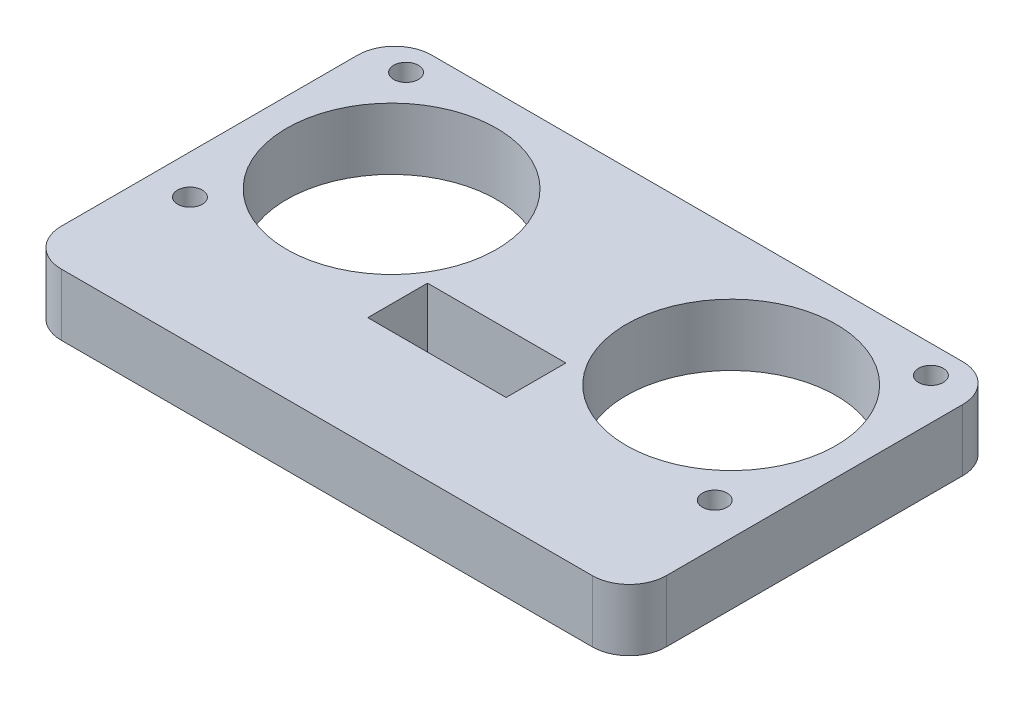
ISO-10303-21;
HEADER;
FILE_DESCRIPTION(('STEP AP214'),'2;1');
FILE_NAME('part.step','',(''),(''),'','','');
FILE_SCHEMA(('AUTOMOTIVE_DESIGN { 1 0 10303 214 1 1 1 1 }'));
ENDSEC;
DATA;
#1=APPLICATION_CONTEXT('core data for automotive mechanical design processes');
#2=APPLICATION_PROTOCOL_DEFINITION('international standard','automotive_design',2000,#1);
#3=PRODUCT_CONTEXT('',#1,'mechanical');
#4=PRODUCT('Part','Part','',(#3));
#5=PRODUCT_RELATED_PRODUCT_CATEGORY('part','',(#4));
#6=PRODUCT_DEFINITION_FORMATION('','',#4);
#7=PRODUCT_DEFINITION_CONTEXT('part definition',#1,'design');
#8=PRODUCT_DEFINITION('design','',#6,#7);
#9=PRODUCT_DEFINITION_SHAPE('','',#8);
#10=(LENGTH_UNIT() NAMED_UNIT(*) SI_UNIT(.MILLI.,.METRE.));
#11=(NAMED_UNIT(*) PLANE_ANGLE_UNIT() SI_UNIT($,.RADIAN.));
#12=(NAMED_UNIT(*) SI_UNIT($,.STERADIAN.) SOLID_ANGLE_UNIT());
#13=UNCERTAINTY_MEASURE_WITH_UNIT(LENGTH_MEASURE(1.E-05),#10,'distance_accuracy_value','');
#14=(GEOMETRIC_REPRESENTATION_CONTEXT(3) GLOBAL_UNCERTAINTY_ASSIGNED_CONTEXT((#13)) GLOBAL_UNIT_ASSIGNED_CONTEXT((#10,
#11,#12)) REPRESENTATION_CONTEXT('',''));
#15=CARTESIAN_POINT('',(0.,0.,0.));
#16=DIRECTION('',(0.,0.,1.));
#17=DIRECTION('',(1.,0.,0.));
#18=AXIS2_PLACEMENT_3D('',#15,#16,#17);
#19=CARTESIAN_POINT('',(0.,3.5,0.));
#20=DIRECTION('',(0.,1.,0.));
#21=DIRECTION('',(0.,0.,1.));
#22=AXIS2_PLACEMENT_3D('',#19,#20,#21);
#23=PLANE('',#22);
#24=CARTESIAN_POINT('',(21.170851111303,3.5,-56.75));
#25=DIRECTION('',(0.,-1.,0.));
#26=DIRECTION('',(0.,0.,-1.));
#27=AXIS2_PLACEMENT_3D('',#24,#25,#26);
#28=CIRCLE('',#27,1.);
#29=CARTESIAN_POINT('',(21.170851111303,3.5,-57.75));
#30=VERTEX_POINT('',#29);
#31=EDGE_CURVE('E325',#30,#30,#28,.T.);
#32=ORIENTED_EDGE('',*,*,#31,.F.);
#33=EDGE_LOOP('',(#32));
#34=FACE_BOUND('',#33,.T.);
#35=CARTESIAN_POINT('',(-21.329148888697,3.5,-56.75));
#36=DIRECTION('',(0.,-1.,0.));
#37=DIRECTION('',(0.,0.,-1.));
#38=AXIS2_PLACEMENT_3D('',#35,#36,#37);
#39=CIRCLE('',#38,1.);
#40=CARTESIAN_POINT('',(-21.329148888697,3.5,-57.75));
#41=VERTEX_POINT('',#40);
#42=EDGE_CURVE('E321',#41,#41,#39,.F.);
#43=ORIENTED_EDGE('',*,*,#42,.T.);
#44=EDGE_LOOP('',(#43));
#45=FACE_BOUND('',#44,.T.);
#46=CARTESIAN_POINT('',(-21.329148888697,3.5,-39.25));
#47=DIRECTION('',(0.,-1.,0.));
#48=DIRECTION('',(0.,0.,-1.));
#49=AXIS2_PLACEMENT_3D('',#46,#47,#48);
#50=CIRCLE('',#49,1.);
#51=CARTESIAN_POINT('',(-21.329148888697,3.5,-40.25));
#52=VERTEX_POINT('',#51);
#53=EDGE_CURVE('E304',#52,#52,#50,.F.);
#54=ORIENTED_EDGE('',*,*,#53,.T.);
#55=EDGE_LOOP('',(#54));
#56=FACE_BOUND('',#55,.T.);
#57=CARTESIAN_POINT('',(13.75,3.5,-48.));
#58=DIRECTION('',(0.,1.,0.));
#59=DIRECTION('',(0.,0.,1.));
#60=AXIS2_PLACEMENT_3D('',#57,#58,#59);
#61=CIRCLE('',#60,8.5);
#62=CARTESIAN_POINT('',(13.75,3.5,-39.5));
#63=VERTEX_POINT('',#62);
#64=EDGE_CURVE('E213',#63,#63,#61,.T.);
#65=ORIENTED_EDGE('',*,*,#64,.T.);
#66=EDGE_LOOP('',(#65));
#67=FACE_BOUND('',#66,.T.);
#68=DIRECTION('',(0.,0.,-1.));
#69=VECTOR('',#68,1.);
#70=CARTESIAN_POINT('',(5.52085111130302,3.5,0.));
#71=LINE('',#70,#69);
#72=CARTESIAN_POINT('',(5.52085111130303,3.5,-38.));
#73=VERTEX_POINT('',#72);
#74=CARTESIAN_POINT('',(5.52085111130303,3.5,-42.84));
#75=VERTEX_POINT('',#74);
#76=EDGE_CURVE('E227',#73,#75,#71,.T.);
#77=ORIENTED_EDGE('',*,*,#76,.T.);
#78=DIRECTION('',(-1.,0.,0.));
#79=VECTOR('',#78,1.);
#80=CARTESIAN_POINT('',(0.,3.5,-42.84));
#81=LINE('',#80,#79);
#82=CARTESIAN_POINT('',(-5.67914888869696,3.5,-42.84));
#83=VERTEX_POINT('',#82);
#84=EDGE_CURVE('E212',#75,#83,#81,.T.);
#85=ORIENTED_EDGE('',*,*,#84,.T.);
#86=DIRECTION('',(0.,0.,1.));
#87=VECTOR('',#86,1.);
#88=CARTESIAN_POINT('',(-5.67914888869696,3.5,0.));
#89=LINE('',#88,#87);
#90=CARTESIAN_POINT('',(-5.67914888869696,3.5,-38.));
#91=VERTEX_POINT('',#90);
#92=EDGE_CURVE('E231',#83,#91,#89,.T.);
#93=ORIENTED_EDGE('',*,*,#92,.T.);
#94=DIRECTION('',(1.,0.,0.));
#95=VECTOR('',#94,1.);
#96=CARTESIAN_POINT('',(0.,3.5,-38.));
#97=LINE('',#96,#95);
#98=EDGE_CURVE('E206',#91,#73,#97,.T.);
#99=ORIENTED_EDGE('',*,*,#98,.T.);
#100=EDGE_LOOP('',(#77,#85,#93,#99));
#101=FACE_BOUND('',#100,.T.);
#102=CARTESIAN_POINT('',(-13.75,3.5,-48.));
#103=DIRECTION('',(0.,1.,0.));
#104=DIRECTION('',(0.,0.,1.));
#105=AXIS2_PLACEMENT_3D('',#102,#103,#104);
#106=CIRCLE('',#105,8.5);
#107=CARTESIAN_POINT('',(-13.75,3.5,-39.5));
#108=VERTEX_POINT('',#107);
#109=EDGE_CURVE('E243',#108,#108,#106,.T.);
#110=ORIENTED_EDGE('',*,*,#109,.T.);
#111=EDGE_LOOP('',(#110));
#112=FACE_BOUND('',#111,.T.);
#113=DIRECTION('',(0.,0.,1.));
#114=VECTOR('',#113,1.);
#115=CARTESIAN_POINT('',(24.5,3.5,0.));
#116=LINE('',#115,#114);
#117=CARTESIAN_POINT('',(24.5,3.5,-56.));
#118=VERTEX_POINT('',#117);
#119=CARTESIAN_POINT('',(24.5,3.5,-32.));
#120=VERTEX_POINT('',#119);
#121=EDGE_CURVE('E255',#118,#120,#116,.T.);
#122=ORIENTED_EDGE('',*,*,#121,.T.);
#123=CARTESIAN_POINT('',(21.5,3.5,-32.));
#124=DIRECTION('',(0.,1.,0.));
#125=DIRECTION('',(0.,0.,1.));
#126=AXIS2_PLACEMENT_3D('',#123,#124,#125);
#127=CIRCLE('',#126,3.);
#128=CARTESIAN_POINT('',(21.5,3.5,-29.));
#129=VERTEX_POINT('',#128);
#130=EDGE_CURVE('E291',#120,#129,#127,.F.);
#131=ORIENTED_EDGE('',*,*,#130,.T.);
#132=DIRECTION('',(-1.,0.,0.));
#133=VECTOR('',#132,1.);
#134=CARTESIAN_POINT('',(0.,3.5,-29.));
#135=LINE('',#134,#133);
#136=CARTESIAN_POINT('',(-21.5,3.5,-29.));
#137=VERTEX_POINT('',#136);
#138=EDGE_CURVE('E229',#129,#137,#135,.T.);
#139=ORIENTED_EDGE('',*,*,#138,.T.);
#140=CARTESIAN_POINT('',(-21.5,3.5,-32.));
#141=DIRECTION('',(0.,1.,0.));
#142=DIRECTION('',(0.,0.,1.));
#143=AXIS2_PLACEMENT_3D('',#140,#141,#142);
#144=CIRCLE('',#143,3.);
#145=CARTESIAN_POINT('',(-24.5,3.5,-32.));
#146=VERTEX_POINT('',#145);
#147=EDGE_CURVE('E289',#137,#146,#144,.F.);
#148=ORIENTED_EDGE('',*,*,#147,.T.);
#149=DIRECTION('',(0.,0.,-1.));
#150=VECTOR('',#149,1.);
#151=CARTESIAN_POINT('',(-24.5,3.5,0.));
#152=LINE('',#151,#150);
#153=CARTESIAN_POINT('',(-24.5,3.5,-56.));
#154=VERTEX_POINT('',#153);
#155=EDGE_CURVE('E262',#146,#154,#152,.T.);
#156=ORIENTED_EDGE('',*,*,#155,.T.);
#157=CARTESIAN_POINT('',(-21.5,3.5,-56.));
#158=DIRECTION('',(0.,1.,0.));
#159=DIRECTION('',(0.,0.,1.));
#160=AXIS2_PLACEMENT_3D('',#157,#158,#159);
#161=CIRCLE('',#160,3.);
#162=CARTESIAN_POINT('',(-21.5,3.5,-59.));
#163=VERTEX_POINT('',#162);
#164=EDGE_CURVE('E264',#154,#163,#161,.F.);
#165=ORIENTED_EDGE('',*,*,#164,.T.);
#166=DIRECTION('',(1.,0.,0.));
#167=VECTOR('',#166,1.);
#168=CARTESIAN_POINT('',(0.,3.5,-59.));
#169=LINE('',#168,#167);
#170=CARTESIAN_POINT('',(21.5,3.5,-59.));
#171=VERTEX_POINT('',#170);
#172=EDGE_CURVE('E249',#163,#171,#169,.T.);
#173=ORIENTED_EDGE('',*,*,#172,.T.);
#174=CARTESIAN_POINT('',(21.5,3.5,-56.));
#175=DIRECTION('',(0.,1.,0.));
#176=DIRECTION('',(0.,0.,1.));
#177=AXIS2_PLACEMENT_3D('',#174,#175,#176);
#178=CIRCLE('',#177,3.);
#179=EDGE_CURVE('E269',#171,#118,#178,.F.);
#180=ORIENTED_EDGE('',*,*,#179,.T.);
#181=EDGE_LOOP('',(#122,#131,#139,#148,#156,#165,#173,#180));
#182=FACE_BOUND('',#181,.T.);
#183=CARTESIAN_POINT('',(21.170851111303,3.5,-39.25));
#184=DIRECTION('',(0.,-1.,0.));
#185=DIRECTION('',(0.,0.,-1.));
#186=AXIS2_PLACEMENT_3D('',#183,#184,#185);
#187=CIRCLE('',#186,1.);
#188=CARTESIAN_POINT('',(21.170851111303,3.5,-40.25));
#189=VERTEX_POINT('',#188);
#190=EDGE_CURVE('E322',#189,#189,#187,.T.);
#191=ORIENTED_EDGE('',*,*,#190,.F.);
#192=EDGE_LOOP('',(#191));
#193=FACE_BOUND('',#192,.T.);
#194=ADVANCED_FACE('F103',(#34,#45,#56,#67,#101,#112,#182,#193),#23,.F.);
#195=CARTESIAN_POINT('',(0.,8.5,0.));
#196=DIRECTION('',(0.,1.,0.));
#197=DIRECTION('',(0.,0.,1.));
#198=AXIS2_PLACEMENT_3D('',#195,#196,#197);
#199=PLANE('',#198);
#200=CARTESIAN_POINT('',(-21.329148888697,8.5,-56.75));
#201=DIRECTION('',(0.,1.,0.));
#202=DIRECTION('',(0.,0.,1.));
#203=AXIS2_PLACEMENT_3D('',#200,#201,#202);
#204=CIRCLE('',#203,1.);
#205=CARTESIAN_POINT('',(-21.329148888697,8.5,-55.75));
#206=VERTEX_POINT('',#205);
#207=EDGE_CURVE('E303',#206,#206,#204,.F.);
#208=ORIENTED_EDGE('',*,*,#207,.T.);
#209=EDGE_LOOP('',(#208));
#210=FACE_BOUND('',#209,.T.);
#211=CARTESIAN_POINT('',(-21.329148888697,8.5,-39.25));
#212=DIRECTION('',(0.,1.,0.));
#213=DIRECTION('',(0.,0.,1.));
#214=AXIS2_PLACEMENT_3D('',#211,#212,#213);
#215=CIRCLE('',#214,1.);
#216=CARTESIAN_POINT('',(-21.329148888697,8.5,-38.25));
#217=VERTEX_POINT('',#216);
#218=EDGE_CURVE('E300',#217,#217,#215,.F.);
#219=ORIENTED_EDGE('',*,*,#218,.T.);
#220=EDGE_LOOP('',(#219));
#221=FACE_BOUND('',#220,.T.);
#222=DIRECTION('',(-1.,0.,0.));
#223=VECTOR('',#222,1.);
#224=CARTESIAN_POINT('',(-38.2971121004907,8.5,-29.));
#225=LINE('',#224,#223);
#226=CARTESIAN_POINT('',(21.5,8.5,-29.));
#227=VERTEX_POINT('',#226);
#228=CARTESIAN_POINT('',(-21.5,8.5,-29.));
#229=VERTEX_POINT('',#228);
#230=EDGE_CURVE('E311',#227,#229,#225,.T.);
#231=ORIENTED_EDGE('',*,*,#230,.F.);
#232=CARTESIAN_POINT('',(21.5,8.5,-32.));
#233=DIRECTION('',(0.,1.,0.));
#234=DIRECTION('',(0.,0.,1.));
#235=AXIS2_PLACEMENT_3D('',#232,#233,#234);
#236=CIRCLE('',#235,3.);
#237=CARTESIAN_POINT('',(24.5,8.5,-32.));
#238=VERTEX_POINT('',#237);
#239=EDGE_CURVE('E112',#227,#238,#236,.T.);
#240=ORIENTED_EDGE('',*,*,#239,.T.);
#241=DIRECTION('',(0.,0.,1.));
#242=VECTOR('',#241,1.);
#243=CARTESIAN_POINT('',(24.5,8.5,0.));
#244=LINE('',#243,#242);
#245=CARTESIAN_POINT('',(24.5,8.5,-56.));
#246=VERTEX_POINT('',#245);
#247=EDGE_CURVE('E258',#246,#238,#244,.T.);
#248=ORIENTED_EDGE('',*,*,#247,.F.);
#249=CARTESIAN_POINT('',(21.5,8.5,-56.));
#250=DIRECTION('',(0.,1.,0.));
#251=DIRECTION('',(0.,0.,1.));
#252=AXIS2_PLACEMENT_3D('',#249,#250,#251);
#253=CIRCLE('',#252,3.);
#254=CARTESIAN_POINT('',(21.5,8.5,-59.));
#255=VERTEX_POINT('',#254);
#256=EDGE_CURVE('E274',#246,#255,#253,.T.);
#257=ORIENTED_EDGE('',*,*,#256,.T.);
#258=DIRECTION('',(1.,0.,0.));
#259=VECTOR('',#258,1.);
#260=CARTESIAN_POINT('',(0.,8.5,-59.));
#261=LINE('',#260,#259);
#262=CARTESIAN_POINT('',(-21.5,8.5,-59.));
#263=VERTEX_POINT('',#262);
#264=EDGE_CURVE('E252',#263,#255,#261,.T.);
#265=ORIENTED_EDGE('',*,*,#264,.F.);
#266=CARTESIAN_POINT('',(-21.5,8.5,-56.));
#267=DIRECTION('',(0.,1.,0.));
#268=DIRECTION('',(0.,0.,1.));
#269=AXIS2_PLACEMENT_3D('',#266,#267,#268);
#270=CIRCLE('',#269,3.);
#271=CARTESIAN_POINT('',(-24.5,8.5,-56.));
#272=VERTEX_POINT('',#271);
#273=EDGE_CURVE('E271',#263,#272,#270,.T.);
#274=ORIENTED_EDGE('',*,*,#273,.T.);
#275=DIRECTION('',(0.,0.,-1.));
#276=VECTOR('',#275,1.);
#277=CARTESIAN_POINT('',(-24.5,8.5,0.));
#278=LINE('',#277,#276);
#279=CARTESIAN_POINT('',(-24.5,8.5,-32.));
#280=VERTEX_POINT('',#279);
#281=EDGE_CURVE('E261',#280,#272,#278,.T.);
#282=ORIENTED_EDGE('',*,*,#281,.F.);
#283=CARTESIAN_POINT('',(-21.5,8.5,-32.));
#284=DIRECTION('',(0.,1.,0.));
#285=DIRECTION('',(0.,0.,1.));
#286=AXIS2_PLACEMENT_3D('',#283,#284,#285);
#287=CIRCLE('',#286,3.);
#288=EDGE_CURVE('E125',#280,#229,#287,.T.);
#289=ORIENTED_EDGE('',*,*,#288,.T.);
#290=EDGE_LOOP('',(#231,#240,#248,#257,#265,#274,#282,#289));
#291=FACE_BOUND('',#290,.T.);
#292=CARTESIAN_POINT('',(13.75,8.5,-48.));
#293=DIRECTION('',(0.,1.,0.));
#294=DIRECTION('',(0.,0.,1.));
#295=AXIS2_PLACEMENT_3D('',#292,#293,#294);
#296=CIRCLE('',#295,8.5);
#297=CARTESIAN_POINT('',(13.75,8.5,-39.5));
#298=VERTEX_POINT('',#297);
#299=EDGE_CURVE('E240',#298,#298,#296,.T.);
#300=ORIENTED_EDGE('',*,*,#299,.F.);
#301=EDGE_LOOP('',(#300));
#302=FACE_BOUND('',#301,.T.);
#303=DIRECTION('',(-1.,0.,0.));
#304=VECTOR('',#303,1.);
#305=CARTESIAN_POINT('',(0.,8.5,-42.84));
#306=LINE('',#305,#304);
#307=CARTESIAN_POINT('',(5.52085111130303,8.5,-42.84));
#308=VERTEX_POINT('',#307);
#309=CARTESIAN_POINT('',(-5.67914888869696,8.5,-42.84));
#310=VERTEX_POINT('',#309);
#311=EDGE_CURVE('E205',#308,#310,#306,.T.);
#312=ORIENTED_EDGE('',*,*,#311,.F.);
#313=DIRECTION('',(0.,0.,-1.));
#314=VECTOR('',#313,1.);
#315=CARTESIAN_POINT('',(5.52085111130302,8.5,0.));
#316=LINE('',#315,#314);
#317=CARTESIAN_POINT('',(5.52085111130303,8.5,-38.));
#318=VERTEX_POINT('',#317);
#319=EDGE_CURVE('E195',#318,#308,#316,.T.);
#320=ORIENTED_EDGE('',*,*,#319,.F.);
#321=DIRECTION('',(1.,0.,0.));
#322=VECTOR('',#321,1.);
#323=CARTESIAN_POINT('',(0.,8.5,-38.));
#324=LINE('',#323,#322);
#325=CARTESIAN_POINT('',(-5.67914888869696,8.5,-38.));
#326=VERTEX_POINT('',#325);
#327=EDGE_CURVE('E222',#326,#318,#324,.T.);
#328=ORIENTED_EDGE('',*,*,#327,.F.);
#329=DIRECTION('',(0.,0.,1.));
#330=VECTOR('',#329,1.);
#331=CARTESIAN_POINT('',(-5.67914888869696,8.5,0.));
#332=LINE('',#331,#330);
#333=EDGE_CURVE('E220',#310,#326,#332,.T.);
#334=ORIENTED_EDGE('',*,*,#333,.F.);
#335=EDGE_LOOP('',(#312,#320,#328,#334));
#336=FACE_BOUND('',#335,.T.);
#337=CARTESIAN_POINT('',(-13.75,8.5,-48.));
#338=DIRECTION('',(0.,1.,0.));
#339=DIRECTION('',(0.,0.,1.));
#340=AXIS2_PLACEMENT_3D('',#337,#338,#339);
#341=CIRCLE('',#340,8.5);
#342=CARTESIAN_POINT('',(-13.75,8.5,-39.5));
#343=VERTEX_POINT('',#342);
#344=EDGE_CURVE('E246',#343,#343,#341,.T.);
#345=ORIENTED_EDGE('',*,*,#344,.F.);
#346=EDGE_LOOP('',(#345));
#347=FACE_BOUND('',#346,.T.);
#348=CARTESIAN_POINT('',(21.170851111303,8.5,-56.75));
#349=DIRECTION('',(0.,1.,0.));
#350=DIRECTION('',(0.,0.,1.));
#351=AXIS2_PLACEMENT_3D('',#348,#349,#350);
#352=CIRCLE('',#351,1.);
#353=CARTESIAN_POINT('',(21.170851111303,8.5,-55.75));
#354=VERTEX_POINT('',#353);
#355=EDGE_CURVE('E306',#354,#354,#352,.T.);
#356=ORIENTED_EDGE('',*,*,#355,.F.);
#357=EDGE_LOOP('',(#356));
#358=FACE_BOUND('',#357,.T.);
#359=CARTESIAN_POINT('',(21.170851111303,8.5,-39.25));
#360=DIRECTION('',(0.,1.,0.));
#361=DIRECTION('',(0.,0.,1.));
#362=AXIS2_PLACEMENT_3D('',#359,#360,#361);
#363=CIRCLE('',#362,1.);
#364=CARTESIAN_POINT('',(21.170851111303,8.5,-38.25));
#365=VERTEX_POINT('',#364);
#366=EDGE_CURVE('E107',#365,#365,#363,.T.);
#367=ORIENTED_EDGE('',*,*,#366,.F.);
#368=EDGE_LOOP('',(#367));
#369=FACE_BOUND('',#368,.T.);
#370=ADVANCED_FACE('F217',(#210,#221,#291,#302,#336,#347,#358,#369),#199,.T.);
#371=CARTESIAN_POINT('',(24.5,8.5,0.));
#372=DIRECTION('',(1.,0.,0.));
#373=DIRECTION('',(0.,0.,-1.));
#374=AXIS2_PLACEMENT_3D('',#371,#372,#373);
#375=PLANE('',#374);
#376=ORIENTED_EDGE('',*,*,#247,.T.);
#377=DIRECTION('',(0.,-1.,0.));
#378=VECTOR('',#377,1.);
#379=CARTESIAN_POINT('',(24.5,3.5,-32.));
#380=LINE('',#379,#378);
#381=EDGE_CURVE('E286',#238,#120,#380,.T.);
#382=ORIENTED_EDGE('',*,*,#381,.T.);
#383=ORIENTED_EDGE('',*,*,#121,.F.);
#384=DIRECTION('',(0.,-1.,0.));
#385=VECTOR('',#384,1.);
#386=CARTESIAN_POINT('',(24.5,8.5,-56.));
#387=LINE('',#386,#385);
#388=EDGE_CURVE('E281',#118,#246,#387,.F.);
#389=ORIENTED_EDGE('',*,*,#388,.T.);
#390=EDGE_LOOP('',(#376,#382,#383,#389));
#391=FACE_BOUND('',#390,.T.);
#392=ADVANCED_FACE('F355',(#391),#375,.T.);
#393=CARTESIAN_POINT('',(-24.5,8.5,0.));
#394=DIRECTION('',(-1.,0.,0.));
#395=DIRECTION('',(0.,0.,1.));
#396=AXIS2_PLACEMENT_3D('',#393,#394,#395);
#397=PLANE('',#396);
#398=ORIENTED_EDGE('',*,*,#155,.F.);
#399=DIRECTION('',(0.,-1.,0.));
#400=VECTOR('',#399,1.);
#401=CARTESIAN_POINT('',(-24.5,8.5,-32.));
#402=LINE('',#401,#400);
#403=EDGE_CURVE('E12',#146,#280,#402,.F.);
#404=ORIENTED_EDGE('',*,*,#403,.T.);
#405=ORIENTED_EDGE('',*,*,#281,.T.);
#406=DIRECTION('',(0.,-1.,0.));
#407=VECTOR('',#406,1.);
#408=CARTESIAN_POINT('',(-24.5,8.5,-56.));
#409=LINE('',#408,#407);
#410=EDGE_CURVE('E283',#272,#154,#409,.T.);
#411=ORIENTED_EDGE('',*,*,#410,.T.);
#412=EDGE_LOOP('',(#398,#404,#405,#411));
#413=FACE_BOUND('',#412,.T.);
#414=ADVANCED_FACE('F361',(#413),#397,.T.);
#415=CARTESIAN_POINT('',(0.,8.5,-59.));
#416=DIRECTION('',(0.,0.,-1.));
#417=DIRECTION('',(-1.,0.,0.));
#418=AXIS2_PLACEMENT_3D('',#415,#416,#417);
#419=PLANE('',#418);
#420=ORIENTED_EDGE('',*,*,#264,.T.);
#421=DIRECTION('',(0.,-1.,0.));
#422=VECTOR('',#421,1.);
#423=CARTESIAN_POINT('',(21.5,8.5,-59.));
#424=LINE('',#423,#422);
#425=EDGE_CURVE('E278',#255,#171,#424,.T.);
#426=ORIENTED_EDGE('',*,*,#425,.T.);
#427=ORIENTED_EDGE('',*,*,#172,.F.);
#428=DIRECTION('',(0.,-1.,0.));
#429=VECTOR('',#428,1.);
#430=CARTESIAN_POINT('',(-21.5,8.5,-59.));
#431=LINE('',#430,#429);
#432=EDGE_CURVE('E276',#163,#263,#431,.F.);
#433=ORIENTED_EDGE('',*,*,#432,.T.);
#434=EDGE_LOOP('',(#420,#426,#427,#433));
#435=FACE_BOUND('',#434,.T.);
#436=ADVANCED_FACE('F364',(#435),#419,.T.);
#437=CARTESIAN_POINT('',(-13.75,8.5,-48.));
#438=DIRECTION('',(0.,-1.,0.));
#439=DIRECTION('',(0.,0.,-1.));
#440=AXIS2_PLACEMENT_3D('',#437,#438,#439);
#441=CYLINDRICAL_SURFACE('',#440,8.5);
#442=ORIENTED_EDGE('',*,*,#344,.T.);
#443=EDGE_LOOP('',(#442));
#444=FACE_BOUND('',#443,.T.);
#445=ORIENTED_EDGE('',*,*,#109,.F.);
#446=EDGE_LOOP('',(#445));
#447=FACE_BOUND('',#446,.T.);
#448=ADVANCED_FACE('F423',(#444,#447),#441,.F.);
#449=CARTESIAN_POINT('',(5.52085111130302,8.5,0.));
#450=DIRECTION('',(-1.,0.,0.));
#451=DIRECTION('',(0.,0.,1.));
#452=AXIS2_PLACEMENT_3D('',#449,#450,#451);
#453=PLANE('',#452);
#454=ORIENTED_EDGE('',*,*,#76,.F.);
#455=DIRECTION('',(0.,-1.,0.));
#456=VECTOR('',#455,1.);
#457=CARTESIAN_POINT('',(5.52085111130303,8.5,-38.));
#458=LINE('',#457,#456);
#459=EDGE_CURVE('E201',#318,#73,#458,.T.);
#460=ORIENTED_EDGE('',*,*,#459,.F.);
#461=ORIENTED_EDGE('',*,*,#319,.T.);
#462=DIRECTION('',(0.,-1.,0.));
#463=VECTOR('',#462,1.);
#464=CARTESIAN_POINT('',(5.52085111130303,8.5,-42.84));
#465=LINE('',#464,#463);
#466=EDGE_CURVE('E198',#308,#75,#465,.T.);
#467=ORIENTED_EDGE('',*,*,#466,.T.);
#468=EDGE_LOOP('',(#454,#460,#461,#467));
#469=FACE_BOUND('',#468,.T.);
#470=ADVANCED_FACE('F197',(#469),#453,.T.);
#471=CARTESIAN_POINT('',(0.,8.5,-42.84));
#472=DIRECTION('',(0.,0.,1.));
#473=DIRECTION('',(1.,0.,0.));
#474=AXIS2_PLACEMENT_3D('',#471,#472,#473);
#475=PLANE('',#474);
#476=ORIENTED_EDGE('',*,*,#84,.F.);
#477=ORIENTED_EDGE('',*,*,#466,.F.);
#478=ORIENTED_EDGE('',*,*,#311,.T.);
#479=DIRECTION('',(0.,-1.,0.));
#480=VECTOR('',#479,1.);
#481=CARTESIAN_POINT('',(-5.67914888869696,8.5,-42.84));
#482=LINE('',#481,#480);
#483=EDGE_CURVE('E214',#310,#83,#482,.T.);
#484=ORIENTED_EDGE('',*,*,#483,.T.);
#485=EDGE_LOOP('',(#476,#477,#478,#484));
#486=FACE_BOUND('',#485,.T.);
#487=ADVANCED_FACE('F209',(#486),#475,.T.);
#488=CARTESIAN_POINT('',(-5.67914888869696,8.5,0.));
#489=DIRECTION('',(1.,0.,0.));
#490=DIRECTION('',(0.,0.,-1.));
#491=AXIS2_PLACEMENT_3D('',#488,#489,#490);
#492=PLANE('',#491);
#493=ORIENTED_EDGE('',*,*,#92,.F.);
#494=ORIENTED_EDGE('',*,*,#483,.F.);
#495=ORIENTED_EDGE('',*,*,#333,.T.);
#496=DIRECTION('',(0.,-1.,0.));
#497=VECTOR('',#496,1.);
#498=CARTESIAN_POINT('',(-5.67914888869696,8.5,-38.));
#499=LINE('',#498,#497);
#500=EDGE_CURVE('E237',#326,#91,#499,.T.);
#501=ORIENTED_EDGE('',*,*,#500,.T.);
#502=EDGE_LOOP('',(#493,#494,#495,#501));
#503=FACE_BOUND('',#502,.T.);
#504=ADVANCED_FACE('F414',(#503),#492,.T.);
#505=CARTESIAN_POINT('',(0.,8.5,-38.));
#506=DIRECTION('',(0.,0.,-1.));
#507=DIRECTION('',(-1.,0.,0.));
#508=AXIS2_PLACEMENT_3D('',#505,#506,#507);
#509=PLANE('',#508);
#510=ORIENTED_EDGE('',*,*,#98,.F.);
#511=ORIENTED_EDGE('',*,*,#500,.F.);
#512=ORIENTED_EDGE('',*,*,#327,.T.);
#513=ORIENTED_EDGE('',*,*,#459,.T.);
#514=EDGE_LOOP('',(#510,#511,#512,#513));
#515=FACE_BOUND('',#514,.T.);
#516=ADVANCED_FACE('F411',(#515),#509,.T.);
#517=CARTESIAN_POINT('',(13.75,8.5,-48.));
#518=DIRECTION('',(0.,-1.,0.));
#519=DIRECTION('',(0.,0.,-1.));
#520=AXIS2_PLACEMENT_3D('',#517,#518,#519);
#521=CYLINDRICAL_SURFACE('',#520,8.5);
#522=ORIENTED_EDGE('',*,*,#299,.T.);
#523=EDGE_LOOP('',(#522));
#524=FACE_BOUND('',#523,.T.);
#525=ORIENTED_EDGE('',*,*,#64,.F.);
#526=EDGE_LOOP('',(#525));
#527=FACE_BOUND('',#526,.T.);
#528=ADVANCED_FACE('F372',(#524,#527),#521,.F.);
#529=CARTESIAN_POINT('',(21.5,8.5,-56.));
#530=DIRECTION('',(0.,-1.,0.));
#531=DIRECTION('',(0.,0.,-1.));
#532=AXIS2_PLACEMENT_3D('',#529,#530,#531);
#533=CYLINDRICAL_SURFACE('',#532,3.);
#534=ORIENTED_EDGE('',*,*,#256,.F.);
#535=ORIENTED_EDGE('',*,*,#388,.F.);
#536=ORIENTED_EDGE('',*,*,#179,.F.);
#537=ORIENTED_EDGE('',*,*,#425,.F.);
#538=EDGE_LOOP('',(#534,#535,#536,#537));
#539=FACE_BOUND('',#538,.T.);
#540=ADVANCED_FACE('F368',(#539),#533,.T.);
#541=CARTESIAN_POINT('',(-21.5,8.5,-56.));
#542=DIRECTION('',(0.,-1.,0.));
#543=DIRECTION('',(0.,0.,-1.));
#544=AXIS2_PLACEMENT_3D('',#541,#542,#543);
#545=CYLINDRICAL_SURFACE('',#544,3.);
#546=ORIENTED_EDGE('',*,*,#273,.F.);
#547=ORIENTED_EDGE('',*,*,#432,.F.);
#548=ORIENTED_EDGE('',*,*,#164,.F.);
#549=ORIENTED_EDGE('',*,*,#410,.F.);
#550=EDGE_LOOP('',(#546,#547,#548,#549));
#551=FACE_BOUND('',#550,.T.);
#552=ADVANCED_FACE('F371',(#551),#545,.T.);
#553=CARTESIAN_POINT('',(-38.2971121004907,-1.5,-29.));
#554=DIRECTION('',(0.,0.,-1.));
#555=DIRECTION('',(-1.,0.,0.));
#556=AXIS2_PLACEMENT_3D('',#553,#554,#555);
#557=PLANE('',#556);
#558=ORIENTED_EDGE('',*,*,#138,.F.);
#559=DIRECTION('',(0.,-1.,0.));
#560=VECTOR('',#559,1.);
#561=CARTESIAN_POINT('',(21.5,8.5,-29.));
#562=LINE('',#561,#560);
#563=EDGE_CURVE('E296',#129,#227,#562,.F.);
#564=ORIENTED_EDGE('',*,*,#563,.T.);
#565=ORIENTED_EDGE('',*,*,#230,.T.);
#566=DIRECTION('',(0.,-1.,0.));
#567=VECTOR('',#566,1.);
#568=CARTESIAN_POINT('',(-21.5,3.5,-29.));
#569=LINE('',#568,#567);
#570=EDGE_CURVE('E293',#229,#137,#569,.T.);
#571=ORIENTED_EDGE('',*,*,#570,.T.);
#572=EDGE_LOOP('',(#558,#564,#565,#571));
#573=FACE_BOUND('',#572,.T.);
#574=ADVANCED_FACE('F375',(#573),#557,.F.);
#575=CARTESIAN_POINT('',(21.5,8.5,-32.));
#576=DIRECTION('',(0.,1.,0.));
#577=DIRECTION('',(0.,0.,1.));
#578=AXIS2_PLACEMENT_3D('',#575,#576,#577);
#579=CYLINDRICAL_SURFACE('',#578,3.);
#580=ORIENTED_EDGE('',*,*,#239,.F.);
#581=ORIENTED_EDGE('',*,*,#563,.F.);
#582=ORIENTED_EDGE('',*,*,#130,.F.);
#583=ORIENTED_EDGE('',*,*,#381,.F.);
#584=EDGE_LOOP('',(#580,#581,#582,#583));
#585=FACE_BOUND('',#584,.T.);
#586=ADVANCED_FACE('F377',(#585),#579,.T.);
#587=CARTESIAN_POINT('',(-21.5,-1.5,-32.));
#588=DIRECTION('',(0.,1.,0.));
#589=DIRECTION('',(0.,0.,1.));
#590=AXIS2_PLACEMENT_3D('',#587,#588,#589);
#591=CYLINDRICAL_SURFACE('',#590,3.);
#592=ORIENTED_EDGE('',*,*,#288,.F.);
#593=ORIENTED_EDGE('',*,*,#403,.F.);
#594=ORIENTED_EDGE('',*,*,#147,.F.);
#595=ORIENTED_EDGE('',*,*,#570,.F.);
#596=EDGE_LOOP('',(#592,#593,#594,#595));
#597=FACE_BOUND('',#596,.T.);
#598=ADVANCED_FACE('F105',(#597),#591,.T.);
#599=CARTESIAN_POINT('',(-21.329148888697,23.5,-39.25));
#600=DIRECTION('',(0.,-1.,0.));
#601=DIRECTION('',(0.,0.,-1.));
#602=AXIS2_PLACEMENT_3D('',#599,#600,#601);
#603=CYLINDRICAL_SURFACE('',#602,1.);
#604=ORIENTED_EDGE('',*,*,#218,.F.);
#605=EDGE_LOOP('',(#604));
#606=FACE_BOUND('',#605,.T.);
#607=ORIENTED_EDGE('',*,*,#53,.F.);
#608=EDGE_LOOP('',(#607));
#609=FACE_BOUND('',#608,.T.);
#610=ADVANCED_FACE('F336',(#606,#609),#603,.F.);
#611=CARTESIAN_POINT('',(-21.329148888697,23.5,-56.75));
#612=DIRECTION('',(0.,-1.,0.));
#613=DIRECTION('',(0.,0.,-1.));
#614=AXIS2_PLACEMENT_3D('',#611,#612,#613);
#615=CYLINDRICAL_SURFACE('',#614,1.);
#616=ORIENTED_EDGE('',*,*,#207,.F.);
#617=EDGE_LOOP('',(#616));
#618=FACE_BOUND('',#617,.T.);
#619=ORIENTED_EDGE('',*,*,#42,.F.);
#620=EDGE_LOOP('',(#619));
#621=FACE_BOUND('',#620,.T.);
#622=ADVANCED_FACE('F333',(#618,#621),#615,.F.);
#623=CARTESIAN_POINT('',(21.170851111303,23.5,-56.75));
#624=DIRECTION('',(0.,-1.,0.));
#625=DIRECTION('',(0.,0.,-1.));
#626=AXIS2_PLACEMENT_3D('',#623,#624,#625);
#627=CYLINDRICAL_SURFACE('',#626,1.);
#628=ORIENTED_EDGE('',*,*,#355,.T.);
#629=EDGE_LOOP('',(#628));
#630=FACE_BOUND('',#629,.T.);
#631=ORIENTED_EDGE('',*,*,#31,.T.);
#632=EDGE_LOOP('',(#631));
#633=FACE_BOUND('',#632,.T.);
#634=ADVANCED_FACE('F335',(#630,#633),#627,.F.);
#635=CARTESIAN_POINT('',(21.170851111303,23.5,-39.25));
#636=DIRECTION('',(0.,-1.,0.));
#637=DIRECTION('',(0.,0.,-1.));
#638=AXIS2_PLACEMENT_3D('',#635,#636,#637);
#639=CYLINDRICAL_SURFACE('',#638,1.);
#640=ORIENTED_EDGE('',*,*,#366,.T.);
#641=EDGE_LOOP('',(#640));
#642=FACE_BOUND('',#641,.T.);
#643=ORIENTED_EDGE('',*,*,#190,.T.);
#644=EDGE_LOOP('',(#643));
#645=FACE_BOUND('',#644,.T.);
#646=ADVANCED_FACE('F343',(#642,#645),#639,.F.);
#647=CLOSED_SHELL('',(#194,#370,#392,#414,#436,#448,#470,#487,#504,#516,#528,#540,#552,#574,
#586,#598,#610,#622,#634,#646));
#648=MANIFOLD_SOLID_BREP('B2',#647);
#649=ADVANCED_BREP_SHAPE_REPRESENTATION('',(#18,#648),#14);
#650=SHAPE_DEFINITION_REPRESENTATION(#9,#649);
ENDSEC;
END-ISO-10303-21;
